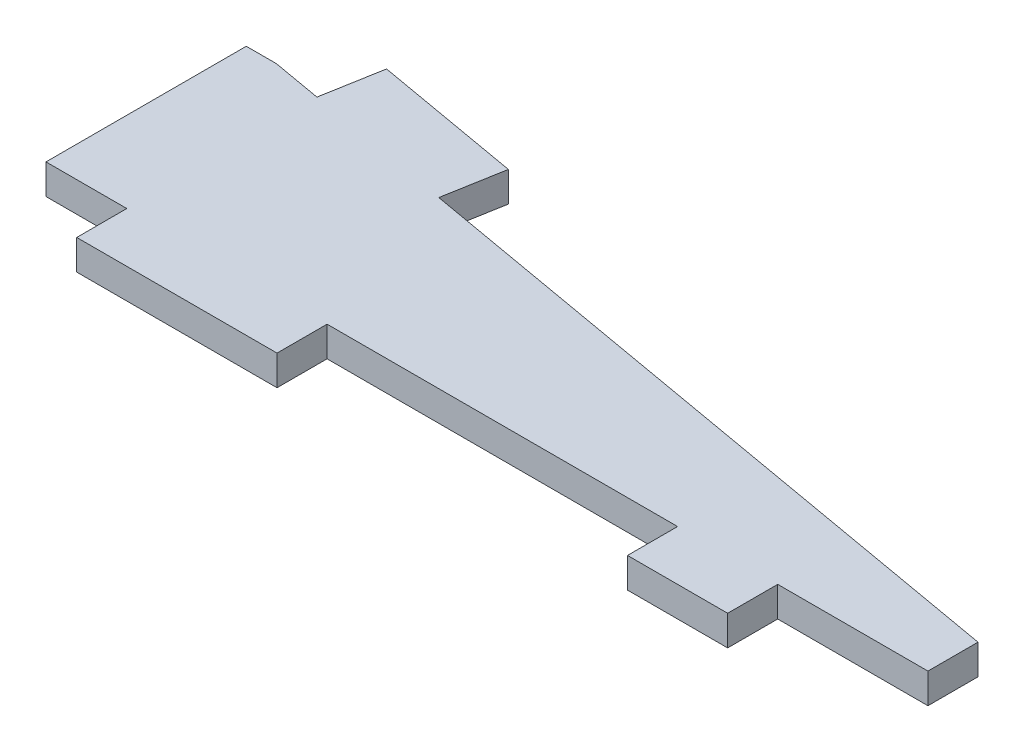
ISO-10303-21;
HEADER;
FILE_DESCRIPTION(('STEP AP214'),'2;1');
FILE_NAME('part.step','',(''),(''),'','','');
FILE_SCHEMA(('AUTOMOTIVE_DESIGN { 1 0 10303 214 1 1 1 1 }'));
ENDSEC;
DATA;
#1=APPLICATION_CONTEXT('core data for automotive mechanical design processes');
#2=APPLICATION_PROTOCOL_DEFINITION('international standard','automotive_design',2000,#1);
#3=PRODUCT_CONTEXT('',#1,'mechanical');
#4=PRODUCT('Part','Part','',(#3));
#5=PRODUCT_RELATED_PRODUCT_CATEGORY('part','',(#4));
#6=PRODUCT_DEFINITION_FORMATION('','',#4);
#7=PRODUCT_DEFINITION_CONTEXT('part definition',#1,'design');
#8=PRODUCT_DEFINITION('design','',#6,#7);
#9=PRODUCT_DEFINITION_SHAPE('','',#8);
#10=(LENGTH_UNIT() NAMED_UNIT(*) SI_UNIT(.MILLI.,.METRE.));
#11=(NAMED_UNIT(*) PLANE_ANGLE_UNIT() SI_UNIT($,.RADIAN.));
#12=(NAMED_UNIT(*) SI_UNIT($,.STERADIAN.) SOLID_ANGLE_UNIT());
#13=UNCERTAINTY_MEASURE_WITH_UNIT(LENGTH_MEASURE(1.E-05),#10,'distance_accuracy_value','');
#14=(GEOMETRIC_REPRESENTATION_CONTEXT(3) GLOBAL_UNCERTAINTY_ASSIGNED_CONTEXT((#13)) GLOBAL_UNIT_ASSIGNED_CONTEXT((#10,
#11,#12)) REPRESENTATION_CONTEXT('',''));
#15=CARTESIAN_POINT('',(0.,0.,0.));
#16=DIRECTION('',(0.,0.,1.));
#17=DIRECTION('',(1.,0.,0.));
#18=AXIS2_PLACEMENT_3D('',#15,#16,#17);
#19=CARTESIAN_POINT('',(4.1223958851919,3.,-23.3792688369561));
#20=DIRECTION('',(-0.173648177666927,0.,0.984807753012208));
#21=DIRECTION('',(0.984807753012209,0.,0.173648177666927));
#22=AXIS2_PLACEMENT_3D('',#19,#20,#21);
#23=PLANE('',#22);
#24=DIRECTION('',(0.,1.,0.));
#25=VECTOR('',#24,1.);
#26=CARTESIAN_POINT('',(-0.145188529206098,0.,-24.1317591116654));
#27=LINE('',#26,#25);
#28=CARTESIAN_POINT('',(-0.145188529206098,0.,-24.1317591116654));
#29=VERTEX_POINT('',#28);
#30=CARTESIAN_POINT('',(-0.145188529206098,3.,-24.1317591116654));
#31=VERTEX_POINT('',#30);
#32=EDGE_CURVE('E161',#29,#31,#27,.T.);
#33=ORIENTED_EDGE('',*,*,#32,.F.);
#34=DIRECTION('',(-0.984807753012209,0.,-0.173648177666927));
#35=VECTOR('',#34,1.);
#36=CARTESIAN_POINT('',(4.1223958851919,0.,-23.3792688369561));
#37=LINE('',#36,#35);
#38=CARTESIAN_POINT('',(-5.06922729426714,0.,-25.));
#39=VERTEX_POINT('',#38);
#40=EDGE_CURVE('E173',#29,#39,#37,.T.);
#41=ORIENTED_EDGE('',*,*,#40,.T.);
#42=DIRECTION('',(0.,-1.,0.));
#43=VECTOR('',#42,1.);
#44=CARTESIAN_POINT('',(-5.06922729426714,3.,-25.));
#45=LINE('',#44,#43);
#46=CARTESIAN_POINT('',(-5.06922729426714,3.,-25.));
#47=VERTEX_POINT('',#46);
#48=EDGE_CURVE('E210',#47,#39,#45,.T.);
#49=ORIENTED_EDGE('',*,*,#48,.F.);
#50=DIRECTION('',(-0.984807753012209,0.,-0.173648177666927));
#51=VECTOR('',#50,1.);
#52=CARTESIAN_POINT('',(4.1223958851919,3.,-23.3792688369561));
#53=LINE('',#52,#51);
#54=EDGE_CURVE('E175',#31,#47,#53,.T.);
#55=ORIENTED_EDGE('',*,*,#54,.F.);
#56=EDGE_LOOP('',(#33,#41,#49,#55));
#57=FACE_BOUND('',#56,.T.);
#58=ADVANCED_FACE('F38',(#57),#23,.F.);
#59=CARTESIAN_POINT('',(0.,3.,-5.));
#60=DIRECTION('',(0.,0.,1.));
#61=DIRECTION('',(1.,0.,0.));
#62=AXIS2_PLACEMENT_3D('',#59,#60,#61);
#63=PLANE('',#62);
#64=DIRECTION('',(0.,1.,0.));
#65=VECTOR('',#64,1.);
#66=CARTESIAN_POINT('',(65.,0.,-5.));
#67=LINE('',#66,#65);
#68=CARTESIAN_POINT('',(65.,0.,-5.));
#69=VERTEX_POINT('',#68);
#70=CARTESIAN_POINT('',(65.,3.,-5.));
#71=VERTEX_POINT('',#70);
#72=EDGE_CURVE('E279',#69,#71,#67,.T.);
#73=ORIENTED_EDGE('',*,*,#72,.F.);
#74=DIRECTION('',(-1.,0.,0.));
#75=VECTOR('',#74,1.);
#76=CARTESIAN_POINT('',(0.,0.,-5.));
#77=LINE('',#76,#75);
#78=CARTESIAN_POINT('',(80.,0.,-5.));
#79=VERTEX_POINT('',#78);
#80=EDGE_CURVE('E189',#79,#69,#77,.T.);
#81=ORIENTED_EDGE('',*,*,#80,.F.);
#82=DIRECTION('',(0.,-1.,0.));
#83=VECTOR('',#82,1.);
#84=CARTESIAN_POINT('',(80.,3.,-5.));
#85=LINE('',#84,#83);
#86=CARTESIAN_POINT('',(80.,3.,-5.));
#87=VERTEX_POINT('',#86);
#88=EDGE_CURVE('E215',#87,#79,#85,.T.);
#89=ORIENTED_EDGE('',*,*,#88,.F.);
#90=DIRECTION('',(-1.,0.,0.));
#91=VECTOR('',#90,1.);
#92=CARTESIAN_POINT('',(0.,3.,-5.));
#93=LINE('',#92,#91);
#94=EDGE_CURVE('E271',#87,#71,#93,.T.);
#95=ORIENTED_EDGE('',*,*,#94,.T.);
#96=EDGE_LOOP('',(#73,#81,#89,#95));
#97=FACE_BOUND('',#96,.T.);
#98=ADVANCED_FACE('F328',(#97),#63,.T.);
#99=CARTESIAN_POINT('',(0.,3.,0.));
#100=DIRECTION('',(0.,0.,-1.));
#101=DIRECTION('',(-1.,0.,0.));
#102=AXIS2_PLACEMENT_3D('',#99,#100,#101);
#103=PLANE('',#102);
#104=DIRECTION('',(1.,0.,0.));
#105=VECTOR('',#104,1.);
#106=CARTESIAN_POINT('',(0.,0.,0.));
#107=LINE('',#106,#105);
#108=CARTESIAN_POINT('',(0.,0.,0.));
#109=VERTEX_POINT('',#108);
#110=CARTESIAN_POINT('',(20.,0.,0.));
#111=VERTEX_POINT('',#110);
#112=EDGE_CURVE('E232',#109,#111,#107,.T.);
#113=ORIENTED_EDGE('',*,*,#112,.T.);
#114=DIRECTION('',(0.,-1.,0.));
#115=VECTOR('',#114,1.);
#116=CARTESIAN_POINT('',(20.,3.,0.));
#117=LINE('',#116,#115);
#118=CARTESIAN_POINT('',(20.,3.,0.));
#119=VERTEX_POINT('',#118);
#120=EDGE_CURVE('E11',#119,#111,#117,.T.);
#121=ORIENTED_EDGE('',*,*,#120,.F.);
#122=DIRECTION('',(1.,0.,0.));
#123=VECTOR('',#122,1.);
#124=CARTESIAN_POINT('',(0.,3.,0.));
#125=LINE('',#124,#123);
#126=CARTESIAN_POINT('',(0.,3.,0.));
#127=VERTEX_POINT('',#126);
#128=EDGE_CURVE('E200',#127,#119,#125,.T.);
#129=ORIENTED_EDGE('',*,*,#128,.F.);
#130=DIRECTION('',(0.,-1.,0.));
#131=VECTOR('',#130,1.);
#132=CARTESIAN_POINT('',(0.,3.,0.));
#133=LINE('',#132,#131);
#134=EDGE_CURVE('E201',#127,#109,#133,.T.);
#135=ORIENTED_EDGE('',*,*,#134,.T.);
#136=EDGE_LOOP('',(#113,#121,#129,#135));
#137=FACE_BOUND('',#136,.T.);
#138=ADVANCED_FACE('F40',(#137),#103,.F.);
#139=CARTESIAN_POINT('',(20.,3.,0.));
#140=DIRECTION('',(-1.,0.,0.));
#141=DIRECTION('',(0.,0.,1.));
#142=AXIS2_PLACEMENT_3D('',#139,#140,#141);
#143=PLANE('',#142);
#144=DIRECTION('',(0.,0.,-1.));
#145=VECTOR('',#144,1.);
#146=CARTESIAN_POINT('',(20.,0.,0.));
#147=LINE('',#146,#145);
#148=CARTESIAN_POINT('',(20.,0.,-5.));
#149=VERTEX_POINT('',#148);
#150=EDGE_CURVE('E228',#111,#149,#147,.T.);
#151=ORIENTED_EDGE('',*,*,#150,.T.);
#152=DIRECTION('',(0.,-1.,0.));
#153=VECTOR('',#152,1.);
#154=CARTESIAN_POINT('',(20.,3.,-5.));
#155=LINE('',#154,#153);
#156=CARTESIAN_POINT('',(20.,3.,-5.));
#157=VERTEX_POINT('',#156);
#158=EDGE_CURVE('E46',#157,#149,#155,.T.);
#159=ORIENTED_EDGE('',*,*,#158,.F.);
#160=DIRECTION('',(0.,0.,-1.));
#161=VECTOR('',#160,1.);
#162=CARTESIAN_POINT('',(20.,3.,0.));
#163=LINE('',#162,#161);
#164=EDGE_CURVE('E275',#119,#157,#163,.T.);
#165=ORIENTED_EDGE('',*,*,#164,.F.);
#166=ORIENTED_EDGE('',*,*,#120,.T.);
#167=EDGE_LOOP('',(#151,#159,#165,#166));
#168=FACE_BOUND('',#167,.T.);
#169=ADVANCED_FACE('F229',(#168),#143,.F.);
#170=DIRECTION('',(0.,1.,0.));
#171=VECTOR('',#170,1.);
#172=CARTESIAN_POINT('',(55.,0.,-5.));
#173=LINE('',#172,#171);
#174=CARTESIAN_POINT('',(55.,0.,-4.99999999999999));
#175=VERTEX_POINT('',#174);
#176=CARTESIAN_POINT('',(55.,3.,-5.));
#177=VERTEX_POINT('',#176);
#178=EDGE_CURVE('E281',#175,#177,#173,.T.);
#179=ORIENTED_EDGE('',*,*,#178,.T.);
#180=EDGE_CURVE('E225',#177,#157,#93,.T.);
#181=ORIENTED_EDGE('',*,*,#180,.T.);
#182=ORIENTED_EDGE('',*,*,#158,.T.);
#183=EDGE_CURVE('E223',#175,#149,#77,.T.);
#184=ORIENTED_EDGE('',*,*,#183,.F.);
#185=EDGE_LOOP('',(#179,#181,#182,#184));
#186=FACE_BOUND('',#185,.T.);
#187=ADVANCED_FACE('F222',(#186),#63,.T.);
#188=CARTESIAN_POINT('',(80.,3.,0.));
#189=DIRECTION('',(-1.,0.,0.));
#190=DIRECTION('',(0.,0.,1.));
#191=AXIS2_PLACEMENT_3D('',#188,#189,#190);
#192=PLANE('',#191);
#193=DIRECTION('',(0.,0.,-1.));
#194=VECTOR('',#193,1.);
#195=CARTESIAN_POINT('',(80.,0.,0.));
#196=LINE('',#195,#194);
#197=CARTESIAN_POINT('',(80.,0.,-10.));
#198=VERTEX_POINT('',#197);
#199=EDGE_CURVE('E186',#79,#198,#196,.T.);
#200=ORIENTED_EDGE('',*,*,#199,.T.);
#201=DIRECTION('',(0.,-1.,0.));
#202=VECTOR('',#201,1.);
#203=CARTESIAN_POINT('',(80.,3.,-10.));
#204=LINE('',#203,#202);
#205=CARTESIAN_POINT('',(80.,3.,-10.));
#206=VERTEX_POINT('',#205);
#207=EDGE_CURVE('E212',#206,#198,#204,.T.);
#208=ORIENTED_EDGE('',*,*,#207,.F.);
#209=DIRECTION('',(0.,0.,-1.));
#210=VECTOR('',#209,1.);
#211=CARTESIAN_POINT('',(80.,3.,0.));
#212=LINE('',#211,#210);
#213=EDGE_CURVE('E274',#87,#206,#212,.T.);
#214=ORIENTED_EDGE('',*,*,#213,.F.);
#215=ORIENTED_EDGE('',*,*,#88,.T.);
#216=EDGE_LOOP('',(#200,#208,#214,#215));
#217=FACE_BOUND('',#216,.T.);
#218=ADVANCED_FACE('F355',(#217),#192,.F.);
#219=CARTESIAN_POINT('',(14.626927765977,0.,-21.5270364466615));
#220=VERTEX_POINT('',#219);
#221=EDGE_CURVE('E185',#198,#220,#37,.T.);
#222=ORIENTED_EDGE('',*,*,#221,.T.);
#223=DIRECTION('',(0.,1.,0.));
#224=VECTOR('',#223,1.);
#225=CARTESIAN_POINT('',(14.626927765977,0.,-21.5270364466615));
#226=LINE('',#225,#224);
#227=CARTESIAN_POINT('',(14.626927765977,3.,-21.5270364466615));
#228=VERTEX_POINT('',#227);
#229=EDGE_CURVE('E176',#220,#228,#226,.T.);
#230=ORIENTED_EDGE('',*,*,#229,.T.);
#231=EDGE_CURVE('E261',#206,#228,#53,.T.);
#232=ORIENTED_EDGE('',*,*,#231,.F.);
#233=ORIENTED_EDGE('',*,*,#207,.T.);
#234=EDGE_LOOP('',(#222,#230,#232,#233));
#235=FACE_BOUND('',#234,.T.);
#236=ADVANCED_FACE('F324',(#235),#23,.F.);
#237=CARTESIAN_POINT('',(0.,3.,-25.));
#238=DIRECTION('',(0.,0.,-1.));
#239=DIRECTION('',(-1.,0.,0.));
#240=AXIS2_PLACEMENT_3D('',#237,#238,#239);
#241=PLANE('',#240);
#242=DIRECTION('',(1.,0.,0.));
#243=VECTOR('',#242,1.);
#244=CARTESIAN_POINT('',(0.,0.,-25.));
#245=LINE('',#244,#243);
#246=CARTESIAN_POINT('',(-8.06922729426714,0.,-25.));
#247=VERTEX_POINT('',#246);
#248=EDGE_CURVE('E184',#247,#39,#245,.T.);
#249=ORIENTED_EDGE('',*,*,#248,.F.);
#250=DIRECTION('',(0.,-1.,0.));
#251=VECTOR('',#250,1.);
#252=CARTESIAN_POINT('',(-8.06922729426714,3.,-25.));
#253=LINE('',#252,#251);
#254=CARTESIAN_POINT('',(-8.06922729426714,3.,-25.));
#255=VERTEX_POINT('',#254);
#256=EDGE_CURVE('E208',#255,#247,#253,.T.);
#257=ORIENTED_EDGE('',*,*,#256,.F.);
#258=DIRECTION('',(1.,0.,0.));
#259=VECTOR('',#258,1.);
#260=CARTESIAN_POINT('',(0.,3.,-25.));
#261=LINE('',#260,#259);
#262=EDGE_CURVE('E259',#255,#47,#261,.T.);
#263=ORIENTED_EDGE('',*,*,#262,.T.);
#264=ORIENTED_EDGE('',*,*,#48,.T.);
#265=EDGE_LOOP('',(#249,#257,#263,#264));
#266=FACE_BOUND('',#265,.T.);
#267=ADVANCED_FACE('F258',(#266),#241,.T.);
#268=CARTESIAN_POINT('',(-8.06922729426714,3.,0.));
#269=DIRECTION('',(-1.,0.,0.));
#270=DIRECTION('',(0.,0.,1.));
#271=AXIS2_PLACEMENT_3D('',#268,#269,#270);
#272=PLANE('',#271);
#273=DIRECTION('',(0.,0.,-1.));
#274=VECTOR('',#273,1.);
#275=CARTESIAN_POINT('',(-8.06922729426714,0.,0.));
#276=LINE('',#275,#274);
#277=CARTESIAN_POINT('',(-8.06922729426714,0.,-5.));
#278=VERTEX_POINT('',#277);
#279=EDGE_CURVE('E194',#278,#247,#276,.T.);
#280=ORIENTED_EDGE('',*,*,#279,.F.);
#281=DIRECTION('',(0.,-1.,0.));
#282=VECTOR('',#281,1.);
#283=CARTESIAN_POINT('',(-8.06922729426714,3.,-5.));
#284=LINE('',#283,#282);
#285=CARTESIAN_POINT('',(-8.06922729426714,3.,-5.));
#286=VERTEX_POINT('',#285);
#287=EDGE_CURVE('E206',#286,#278,#284,.T.);
#288=ORIENTED_EDGE('',*,*,#287,.F.);
#289=DIRECTION('',(0.,0.,-1.));
#290=VECTOR('',#289,1.);
#291=CARTESIAN_POINT('',(-8.06922729426714,3.,0.));
#292=LINE('',#291,#290);
#293=EDGE_CURVE('E254',#286,#255,#292,.T.);
#294=ORIENTED_EDGE('',*,*,#293,.T.);
#295=ORIENTED_EDGE('',*,*,#256,.T.);
#296=EDGE_LOOP('',(#280,#288,#294,#295));
#297=FACE_BOUND('',#296,.T.);
#298=ADVANCED_FACE('F253',(#297),#272,.T.);
#299=CARTESIAN_POINT('',(0.,0.,-5.));
#300=VERTEX_POINT('',#299);
#301=EDGE_CURVE('E196',#300,#278,#77,.T.);
#302=ORIENTED_EDGE('',*,*,#301,.F.);
#303=DIRECTION('',(0.,-1.,0.));
#304=VECTOR('',#303,1.);
#305=CARTESIAN_POINT('',(0.,3.,-5.));
#306=LINE('',#305,#304);
#307=CARTESIAN_POINT('',(0.,3.,-5.));
#308=VERTEX_POINT('',#307);
#309=EDGE_CURVE('E203',#308,#300,#306,.T.);
#310=ORIENTED_EDGE('',*,*,#309,.F.);
#311=EDGE_CURVE('E249',#308,#286,#93,.T.);
#312=ORIENTED_EDGE('',*,*,#311,.T.);
#313=ORIENTED_EDGE('',*,*,#287,.T.);
#314=EDGE_LOOP('',(#302,#310,#312,#313));
#315=FACE_BOUND('',#314,.T.);
#316=ADVANCED_FACE('F246',(#315),#63,.T.);
#317=CARTESIAN_POINT('',(0.,3.,0.));
#318=DIRECTION('',(-1.,0.,0.));
#319=DIRECTION('',(0.,0.,1.));
#320=AXIS2_PLACEMENT_3D('',#317,#318,#319);
#321=PLANE('',#320);
#322=DIRECTION('',(0.,0.,-1.));
#323=VECTOR('',#322,1.);
#324=CARTESIAN_POINT('',(0.,0.,0.));
#325=LINE('',#324,#323);
#326=EDGE_CURVE('E197',#109,#300,#325,.T.);
#327=ORIENTED_EDGE('',*,*,#326,.F.);
#328=ORIENTED_EDGE('',*,*,#134,.F.);
#329=DIRECTION('',(0.,0.,-1.));
#330=VECTOR('',#329,1.);
#331=CARTESIAN_POINT('',(0.,3.,0.));
#332=LINE('',#331,#330);
#333=EDGE_CURVE('E204',#127,#308,#332,.T.);
#334=ORIENTED_EDGE('',*,*,#333,.T.);
#335=ORIENTED_EDGE('',*,*,#309,.T.);
#336=EDGE_LOOP('',(#327,#328,#334,#335));
#337=FACE_BOUND('',#336,.T.);
#338=ADVANCED_FACE('F371',(#337),#321,.T.);
#339=CARTESIAN_POINT('',(0.,3.,0.));
#340=DIRECTION('',(0.,1.,0.));
#341=DIRECTION('',(0.,0.,1.));
#342=AXIS2_PLACEMENT_3D('',#339,#340,#341);
#343=PLANE('',#342);
#344=ORIENTED_EDGE('',*,*,#128,.T.);
#345=ORIENTED_EDGE('',*,*,#164,.T.);
#346=ORIENTED_EDGE('',*,*,#180,.F.);
#347=DIRECTION('',(0.,0.,1.));
#348=VECTOR('',#347,1.);
#349=CARTESIAN_POINT('',(55.,3.,-5.));
#350=LINE('',#349,#348);
#351=CARTESIAN_POINT('',(55.,3.,0.));
#352=VERTEX_POINT('',#351);
#353=EDGE_CURVE('E291',#177,#352,#350,.T.);
#354=ORIENTED_EDGE('',*,*,#353,.T.);
#355=DIRECTION('',(1.,0.,0.));
#356=VECTOR('',#355,1.);
#357=CARTESIAN_POINT('',(65.,3.,0.));
#358=LINE('',#357,#356);
#359=CARTESIAN_POINT('',(65.,3.,0.));
#360=VERTEX_POINT('',#359);
#361=EDGE_CURVE('E287',#352,#360,#358,.T.);
#362=ORIENTED_EDGE('',*,*,#361,.T.);
#363=DIRECTION('',(0.,0.,-1.));
#364=VECTOR('',#363,1.);
#365=CARTESIAN_POINT('',(65.,3.,-5.));
#366=LINE('',#365,#364);
#367=EDGE_CURVE('E294',#360,#71,#366,.T.);
#368=ORIENTED_EDGE('',*,*,#367,.T.);
#369=ORIENTED_EDGE('',*,*,#94,.F.);
#370=ORIENTED_EDGE('',*,*,#213,.T.);
#371=ORIENTED_EDGE('',*,*,#231,.T.);
#372=DIRECTION('',(0.173648177666927,0.,-0.984807753012209));
#373=VECTOR('',#372,1.);
#374=CARTESIAN_POINT('',(14.626927765977,3.,-21.5270364466615));
#375=LINE('',#374,#373);
#376=CARTESIAN_POINT('',(15.6688168319786,3.,-27.4358829647347));
#377=VERTEX_POINT('',#376);
#378=EDGE_CURVE('E53',#228,#377,#375,.T.);
#379=ORIENTED_EDGE('',*,*,#378,.T.);
#380=DIRECTION('',(-0.984807753012208,0.,-0.173648177666927));
#381=VECTOR('',#380,1.);
#382=CARTESIAN_POINT('',(15.6688168319786,3.,-27.4358829647347));
#383=LINE('',#382,#381);
#384=CARTESIAN_POINT('',(0.896700536795463,3.,-30.0406056297386));
#385=VERTEX_POINT('',#384);
#386=EDGE_CURVE('E168',#377,#385,#383,.T.);
#387=ORIENTED_EDGE('',*,*,#386,.T.);
#388=DIRECTION('',(-0.173648177666927,0.,0.984807753012209));
#389=VECTOR('',#388,1.);
#390=CARTESIAN_POINT('',(0.896700536795463,3.,-30.0406056297386));
#391=LINE('',#390,#389);
#392=EDGE_CURVE('E308',#385,#31,#391,.T.);
#393=ORIENTED_EDGE('',*,*,#392,.T.);
#394=ORIENTED_EDGE('',*,*,#54,.T.);
#395=ORIENTED_EDGE('',*,*,#262,.F.);
#396=ORIENTED_EDGE('',*,*,#293,.F.);
#397=ORIENTED_EDGE('',*,*,#311,.F.);
#398=ORIENTED_EDGE('',*,*,#333,.F.);
#399=EDGE_LOOP('',(#344,#345,#346,#354,#362,#368,#369,#370,#371,#379,#387,#393,#394,#395,#396,
#397,#398));
#400=FACE_BOUND('',#399,.T.);
#401=ADVANCED_FACE('F318',(#400),#343,.T.);
#402=CARTESIAN_POINT('',(0.,0.,0.));
#403=DIRECTION('',(0.,1.,0.));
#404=DIRECTION('',(0.,0.,1.));
#405=AXIS2_PLACEMENT_3D('',#402,#403,#404);
#406=PLANE('',#405);
#407=ORIENTED_EDGE('',*,*,#112,.F.);
#408=ORIENTED_EDGE('',*,*,#326,.T.);
#409=ORIENTED_EDGE('',*,*,#301,.T.);
#410=ORIENTED_EDGE('',*,*,#279,.T.);
#411=ORIENTED_EDGE('',*,*,#248,.T.);
#412=ORIENTED_EDGE('',*,*,#40,.F.);
#413=DIRECTION('',(-0.173648177666927,0.,0.984807753012209));
#414=VECTOR('',#413,1.);
#415=CARTESIAN_POINT('',(0.896700536795463,0.,-30.0406056297386));
#416=LINE('',#415,#414);
#417=CARTESIAN_POINT('',(0.896700536795463,0.,-30.0406056297386));
#418=VERTEX_POINT('',#417);
#419=EDGE_CURVE('E157',#418,#29,#416,.T.);
#420=ORIENTED_EDGE('',*,*,#419,.F.);
#421=DIRECTION('',(-0.984807753012208,0.,-0.173648177666927));
#422=VECTOR('',#421,1.);
#423=CARTESIAN_POINT('',(15.6688168319786,0.,-27.4358829647347));
#424=LINE('',#423,#422);
#425=CARTESIAN_POINT('',(15.6688168319786,0.,-27.4358829647347));
#426=VERTEX_POINT('',#425);
#427=EDGE_CURVE('E177',#426,#418,#424,.T.);
#428=ORIENTED_EDGE('',*,*,#427,.F.);
#429=DIRECTION('',(0.173648177666927,0.,-0.984807753012209));
#430=VECTOR('',#429,1.);
#431=CARTESIAN_POINT('',(14.626927765977,0.,-21.5270364466615));
#432=LINE('',#431,#430);
#433=EDGE_CURVE('E167',#220,#426,#432,.T.);
#434=ORIENTED_EDGE('',*,*,#433,.F.);
#435=ORIENTED_EDGE('',*,*,#221,.F.);
#436=ORIENTED_EDGE('',*,*,#199,.F.);
#437=ORIENTED_EDGE('',*,*,#80,.T.);
#438=DIRECTION('',(0.,0.,-1.));
#439=VECTOR('',#438,1.);
#440=CARTESIAN_POINT('',(65.,0.,-5.));
#441=LINE('',#440,#439);
#442=CARTESIAN_POINT('',(65.,0.,0.));
#443=VERTEX_POINT('',#442);
#444=EDGE_CURVE('E290',#443,#69,#441,.T.);
#445=ORIENTED_EDGE('',*,*,#444,.F.);
#446=DIRECTION('',(1.,0.,0.));
#447=VECTOR('',#446,1.);
#448=CARTESIAN_POINT('',(65.,0.,0.));
#449=LINE('',#448,#447);
#450=CARTESIAN_POINT('',(55.,0.,0.));
#451=VERTEX_POINT('',#450);
#452=EDGE_CURVE('E282',#451,#443,#449,.T.);
#453=ORIENTED_EDGE('',*,*,#452,.F.);
#454=DIRECTION('',(0.,0.,1.));
#455=VECTOR('',#454,1.);
#456=CARTESIAN_POINT('',(55.,0.,-5.));
#457=LINE('',#456,#455);
#458=EDGE_CURVE('E61',#175,#451,#457,.T.);
#459=ORIENTED_EDGE('',*,*,#458,.F.);
#460=ORIENTED_EDGE('',*,*,#183,.T.);
#461=ORIENTED_EDGE('',*,*,#150,.F.);
#462=EDGE_LOOP('',(#407,#408,#409,#410,#411,#412,#420,#428,#434,#435,#436,#437,#445,#453,#459,
#460,#461));
#463=FACE_BOUND('',#462,.T.);
#464=ADVANCED_FACE('F181',(#463),#406,.F.);
#465=CARTESIAN_POINT('',(65.,0.,-5.));
#466=DIRECTION('',(1.,0.,0.));
#467=DIRECTION('',(0.,0.,-1.));
#468=AXIS2_PLACEMENT_3D('',#465,#466,#467);
#469=PLANE('',#468);
#470=ORIENTED_EDGE('',*,*,#367,.F.);
#471=DIRECTION('',(0.,1.,0.));
#472=VECTOR('',#471,1.);
#473=CARTESIAN_POINT('',(65.,0.,0.));
#474=LINE('',#473,#472);
#475=EDGE_CURVE('E234',#443,#360,#474,.T.);
#476=ORIENTED_EDGE('',*,*,#475,.F.);
#477=ORIENTED_EDGE('',*,*,#444,.T.);
#478=ORIENTED_EDGE('',*,*,#72,.T.);
#479=EDGE_LOOP('',(#470,#476,#477,#478));
#480=FACE_BOUND('',#479,.T.);
#481=ADVANCED_FACE('F331',(#480),#469,.T.);
#482=CARTESIAN_POINT('',(65.,0.,0.));
#483=DIRECTION('',(0.,0.,1.));
#484=DIRECTION('',(1.,0.,0.));
#485=AXIS2_PLACEMENT_3D('',#482,#483,#484);
#486=PLANE('',#485);
#487=ORIENTED_EDGE('',*,*,#361,.F.);
#488=DIRECTION('',(0.,1.,0.));
#489=VECTOR('',#488,1.);
#490=CARTESIAN_POINT('',(55.,0.,0.));
#491=LINE('',#490,#489);
#492=EDGE_CURVE('E284',#451,#352,#491,.T.);
#493=ORIENTED_EDGE('',*,*,#492,.F.);
#494=ORIENTED_EDGE('',*,*,#452,.T.);
#495=ORIENTED_EDGE('',*,*,#475,.T.);
#496=EDGE_LOOP('',(#487,#493,#494,#495));
#497=FACE_BOUND('',#496,.T.);
#498=ADVANCED_FACE('F334',(#497),#486,.T.);
#499=CARTESIAN_POINT('',(55.,0.,-5.));
#500=DIRECTION('',(-1.,0.,0.));
#501=DIRECTION('',(0.,0.,1.));
#502=AXIS2_PLACEMENT_3D('',#499,#500,#501);
#503=PLANE('',#502);
#504=ORIENTED_EDGE('',*,*,#353,.F.);
#505=ORIENTED_EDGE('',*,*,#178,.F.);
#506=ORIENTED_EDGE('',*,*,#458,.T.);
#507=ORIENTED_EDGE('',*,*,#492,.T.);
#508=EDGE_LOOP('',(#504,#505,#506,#507));
#509=FACE_BOUND('',#508,.T.);
#510=ADVANCED_FACE('F336',(#509),#503,.T.);
#511=CARTESIAN_POINT('',(0.896700536795463,0.,-30.0406056297386));
#512=DIRECTION('',(-0.984807753012209,0.,-0.173648177666927));
#513=DIRECTION('',(-0.173648177666927,0.,0.984807753012209));
#514=AXIS2_PLACEMENT_3D('',#511,#512,#513);
#515=PLANE('',#514);
#516=ORIENTED_EDGE('',*,*,#392,.F.);
#517=DIRECTION('',(0.,1.,0.));
#518=VECTOR('',#517,1.);
#519=CARTESIAN_POINT('',(0.896700536795463,0.,-30.0406056297386));
#520=LINE('',#519,#518);
#521=EDGE_CURVE('E163',#418,#385,#520,.T.);
#522=ORIENTED_EDGE('',*,*,#521,.F.);
#523=ORIENTED_EDGE('',*,*,#419,.T.);
#524=ORIENTED_EDGE('',*,*,#32,.T.);
#525=EDGE_LOOP('',(#516,#522,#523,#524));
#526=FACE_BOUND('',#525,.T.);
#527=ADVANCED_FACE('F160',(#526),#515,.T.);
#528=CARTESIAN_POINT('',(15.6688168319786,0.,-27.4358829647347));
#529=DIRECTION('',(0.173648177666927,0.,-0.984807753012209));
#530=DIRECTION('',(-0.984807753012209,0.,-0.173648177666927));
#531=AXIS2_PLACEMENT_3D('',#528,#529,#530);
#532=PLANE('',#531);
#533=ORIENTED_EDGE('',*,*,#386,.F.);
#534=DIRECTION('',(0.,1.,0.));
#535=VECTOR('',#534,1.);
#536=CARTESIAN_POINT('',(15.6688168319786,0.,-27.4358829647347));
#537=LINE('',#536,#535);
#538=EDGE_CURVE('E302',#426,#377,#537,.T.);
#539=ORIENTED_EDGE('',*,*,#538,.F.);
#540=ORIENTED_EDGE('',*,*,#427,.T.);
#541=ORIENTED_EDGE('',*,*,#521,.T.);
#542=EDGE_LOOP('',(#533,#539,#540,#541));
#543=FACE_BOUND('',#542,.T.);
#544=ADVANCED_FACE('F317',(#543),#532,.T.);
#545=CARTESIAN_POINT('',(14.626927765977,0.,-21.5270364466615));
#546=DIRECTION('',(0.984807753012208,0.,0.173648177666927));
#547=DIRECTION('',(0.173648177666927,0.,-0.984807753012209));
#548=AXIS2_PLACEMENT_3D('',#545,#546,#547);
#549=PLANE('',#548);
#550=ORIENTED_EDGE('',*,*,#378,.F.);
#551=ORIENTED_EDGE('',*,*,#229,.F.);
#552=ORIENTED_EDGE('',*,*,#433,.T.);
#553=ORIENTED_EDGE('',*,*,#538,.T.);
#554=EDGE_LOOP('',(#550,#551,#552,#553));
#555=FACE_BOUND('',#554,.T.);
#556=ADVANCED_FACE('F313',(#555),#549,.T.);
#557=CLOSED_SHELL('',(#58,#98,#138,#169,#187,#218,#236,#267,#298,#316,#338,#401,#464,#481,#498,
#510,#527,#544,#556));
#558=MANIFOLD_SOLID_BREP('B2',#557);
#559=ADVANCED_BREP_SHAPE_REPRESENTATION('',(#18,#558),#14);
#560=SHAPE_DEFINITION_REPRESENTATION(#9,#559);
ENDSEC;
END-ISO-10303-21;
